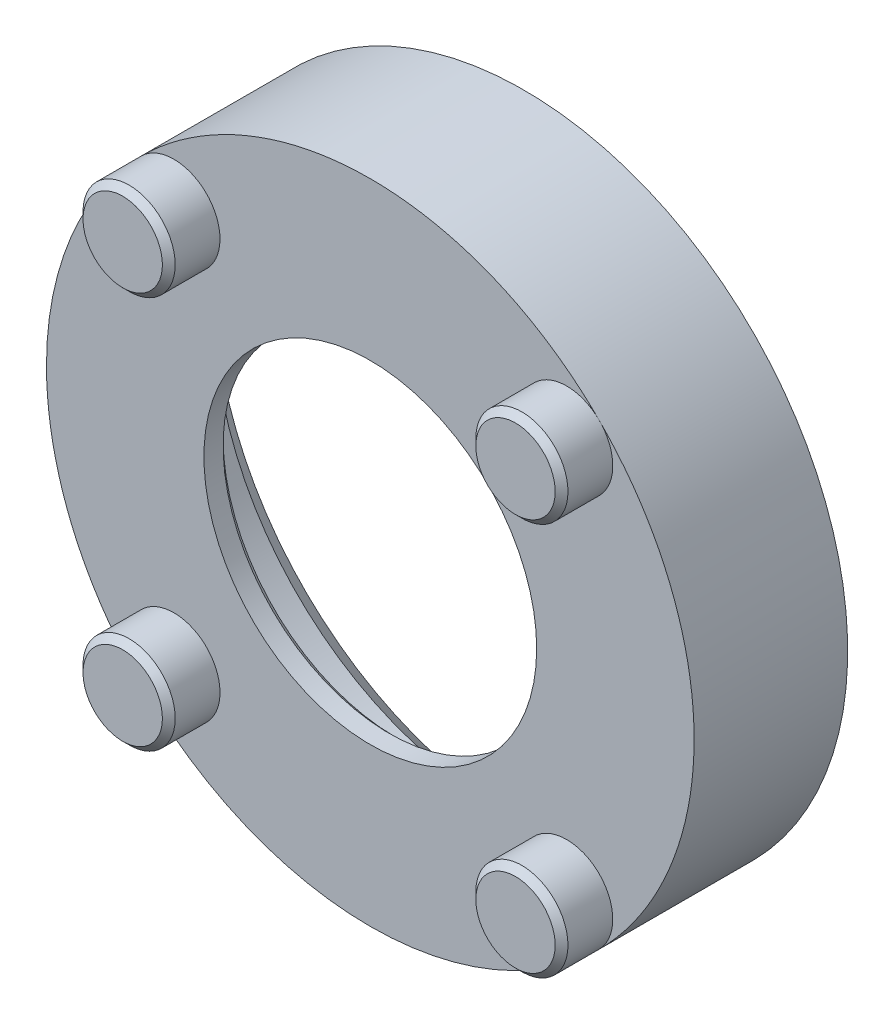
ISO-10303-21;
HEADER;
FILE_DESCRIPTION(('STEP AP214'),'2;1');
FILE_NAME('part.step','',(''),(''),'','','');
FILE_SCHEMA(('AUTOMOTIVE_DESIGN { 1 0 10303 214 1 1 1 1 }'));
ENDSEC;
DATA;
#1=APPLICATION_CONTEXT('core data for automotive mechanical design processes');
#2=APPLICATION_PROTOCOL_DEFINITION('international standard','automotive_design',2000,#1);
#3=PRODUCT_CONTEXT('',#1,'mechanical');
#4=PRODUCT('Part','Part','',(#3));
#5=PRODUCT_RELATED_PRODUCT_CATEGORY('part','',(#4));
#6=PRODUCT_DEFINITION_FORMATION('','',#4);
#7=PRODUCT_DEFINITION_CONTEXT('part definition',#1,'design');
#8=PRODUCT_DEFINITION('design','',#6,#7);
#9=PRODUCT_DEFINITION_SHAPE('','',#8);
#10=(LENGTH_UNIT() NAMED_UNIT(*) SI_UNIT(.MILLI.,.METRE.));
#11=(NAMED_UNIT(*) PLANE_ANGLE_UNIT() SI_UNIT($,.RADIAN.));
#12=(NAMED_UNIT(*) SI_UNIT($,.STERADIAN.) SOLID_ANGLE_UNIT());
#13=UNCERTAINTY_MEASURE_WITH_UNIT(LENGTH_MEASURE(1.E-05),#10,'distance_accuracy_value','');
#14=(GEOMETRIC_REPRESENTATION_CONTEXT(3) GLOBAL_UNCERTAINTY_ASSIGNED_CONTEXT((#13)) GLOBAL_UNIT_ASSIGNED_CONTEXT((#10,
#11,#12)) REPRESENTATION_CONTEXT('',''));
#15=CARTESIAN_POINT('',(0.,0.,0.));
#16=DIRECTION('',(0.,0.,1.));
#17=DIRECTION('',(1.,0.,0.));
#18=AXIS2_PLACEMENT_3D('',#15,#16,#17);
#19=CARTESIAN_POINT('',(7.67210857587403,-7.67210857587405,3.));
#20=DIRECTION('',(0.,0.,-1.));
#21=DIRECTION('',(-1.,0.,0.));
#22=AXIS2_PLACEMENT_3D('',#19,#20,#21);
#23=CYLINDRICAL_SURFACE('',#22,1.8);
#24=CARTESIAN_POINT('',(7.67210857587403,-7.67210857587405,2.75));
#25=DIRECTION('',(0.,0.,1.));
#26=DIRECTION('',(1.,0.,0.));
#27=AXIS2_PLACEMENT_3D('',#24,#25,#26);
#28=CIRCLE('',#27,1.8);
#29=CARTESIAN_POINT('',(9.47210857587403,-7.67210857587405,2.75));
#30=VERTEX_POINT('',#29);
#31=EDGE_CURVE('E140',#30,#30,#28,.F.);
#32=ORIENTED_EDGE('',*,*,#31,.T.);
#33=EDGE_LOOP('',(#32));
#34=FACE_BOUND('',#33,.T.);
#35=CARTESIAN_POINT('',(7.67210857587403,-7.67210857587405,1.));
#36=DIRECTION('',(0.,0.,1.));
#37=DIRECTION('',(1.,0.,0.));
#38=AXIS2_PLACEMENT_3D('',#35,#36,#37);
#39=CIRCLE('',#38,1.8);
#40=CARTESIAN_POINT('',(8.94490078200951,-8.94490078200954,1.));
#41=VERTEX_POINT('',#40);
#42=EDGE_CURVE('E81',#41,#41,#39,.T.);
#43=ORIENTED_EDGE('',*,*,#42,.T.);
#44=EDGE_LOOP('',(#43));
#45=FACE_BOUND('',#44,.T.);
#46=ADVANCED_FACE('F51',(#34,#45),#23,.T.);
#47=CARTESIAN_POINT('',(-7.67210857587375,-7.67210857587433,3.));
#48=DIRECTION('',(0.,0.,-1.));
#49=DIRECTION('',(-1.,0.,0.));
#50=AXIS2_PLACEMENT_3D('',#47,#48,#49);
#51=CYLINDRICAL_SURFACE('',#50,1.8);
#52=CARTESIAN_POINT('',(-7.67210857587375,-7.67210857587433,2.75));
#53=DIRECTION('',(0.,0.,1.));
#54=DIRECTION('',(1.,0.,0.));
#55=AXIS2_PLACEMENT_3D('',#52,#53,#54);
#56=CIRCLE('',#55,1.8);
#57=CARTESIAN_POINT('',(-5.87210857587375,-7.67210857587433,2.75));
#58=VERTEX_POINT('',#57);
#59=EDGE_CURVE('E132',#58,#58,#56,.F.);
#60=ORIENTED_EDGE('',*,*,#59,.T.);
#61=EDGE_LOOP('',(#60));
#62=FACE_BOUND('',#61,.T.);
#63=CARTESIAN_POINT('',(-7.67210857587375,-7.67210857587433,1.));
#64=DIRECTION('',(0.,0.,1.));
#65=DIRECTION('',(1.,0.,0.));
#66=AXIS2_PLACEMENT_3D('',#63,#64,#65);
#67=CIRCLE('',#66,1.8);
#68=CARTESIAN_POINT('',(-8.94490078200919,-8.94490078200987,1.));
#69=VERTEX_POINT('',#68);
#70=EDGE_CURVE('E86',#69,#69,#67,.T.);
#71=ORIENTED_EDGE('',*,*,#70,.T.);
#72=EDGE_LOOP('',(#71));
#73=FACE_BOUND('',#72,.T.);
#74=ADVANCED_FACE('F166',(#62,#73),#51,.T.);
#75=CARTESIAN_POINT('',(-7.67210857587403,7.67210857587344,3.));
#76=DIRECTION('',(0.,0.,-1.));
#77=DIRECTION('',(-1.,0.,0.));
#78=AXIS2_PLACEMENT_3D('',#75,#76,#77);
#79=CYLINDRICAL_SURFACE('',#78,1.8);
#80=CARTESIAN_POINT('',(-7.67210857587403,7.67210857587344,2.75));
#81=DIRECTION('',(0.,0.,1.));
#82=DIRECTION('',(1.,0.,0.));
#83=AXIS2_PLACEMENT_3D('',#80,#81,#82);
#84=CIRCLE('',#83,1.8);
#85=CARTESIAN_POINT('',(-5.87210857587403,7.67210857587344,2.75));
#86=VERTEX_POINT('',#85);
#87=EDGE_CURVE('E116',#86,#86,#84,.F.);
#88=ORIENTED_EDGE('',*,*,#87,.T.);
#89=EDGE_LOOP('',(#88));
#90=FACE_BOUND('',#89,.T.);
#91=CARTESIAN_POINT('',(-7.67210857587403,7.67210857587344,1.));
#92=DIRECTION('',(0.,0.,1.));
#93=DIRECTION('',(1.,0.,0.));
#94=AXIS2_PLACEMENT_3D('',#91,#92,#93);
#95=CIRCLE('',#94,1.8);
#96=CARTESIAN_POINT('',(-8.94490078200987,8.94490078200919,1.));
#97=VERTEX_POINT('',#96);
#98=EDGE_CURVE('E73',#97,#97,#95,.T.);
#99=ORIENTED_EDGE('',*,*,#98,.T.);
#100=EDGE_LOOP('',(#99));
#101=FACE_BOUND('',#100,.T.);
#102=ADVANCED_FACE('F172',(#90,#101),#79,.T.);
#103=CARTESIAN_POINT('',(7.67210857587375,7.67210857587372,3.));
#104=DIRECTION('',(0.,0.,-1.));
#105=DIRECTION('',(-1.,0.,0.));
#106=AXIS2_PLACEMENT_3D('',#103,#104,#105);
#107=CYLINDRICAL_SURFACE('',#106,1.8);
#108=CARTESIAN_POINT('',(7.67210857587375,7.67210857587372,2.75));
#109=DIRECTION('',(0.,0.,1.));
#110=DIRECTION('',(1.,0.,0.));
#111=AXIS2_PLACEMENT_3D('',#108,#109,#110);
#112=CIRCLE('',#111,1.8);
#113=CARTESIAN_POINT('',(9.47210857587375,7.67210857587372,2.75));
#114=VERTEX_POINT('',#113);
#115=EDGE_CURVE('E124',#114,#114,#112,.F.);
#116=ORIENTED_EDGE('',*,*,#115,.T.);
#117=EDGE_LOOP('',(#116));
#118=FACE_BOUND('',#117,.T.);
#119=CARTESIAN_POINT('',(7.67210857587375,7.67210857587372,1.));
#120=DIRECTION('',(0.,0.,1.));
#121=DIRECTION('',(1.,0.,0.));
#122=AXIS2_PLACEMENT_3D('',#119,#120,#121);
#123=CIRCLE('',#122,1.8);
#124=CARTESIAN_POINT('',(8.94490078200955,8.94490078200951,1.));
#125=VERTEX_POINT('',#124);
#126=EDGE_CURVE('E68',#125,#125,#123,.T.);
#127=ORIENTED_EDGE('',*,*,#126,.T.);
#128=EDGE_LOOP('',(#127));
#129=FACE_BOUND('',#128,.T.);
#130=ADVANCED_FACE('F186',(#118,#129),#107,.T.);
#131=CARTESIAN_POINT('',(0.,0.,-5.));
#132=DIRECTION('',(0.,0.,1.));
#133=DIRECTION('',(1.,0.,0.));
#134=AXIS2_PLACEMENT_3D('',#131,#132,#133);
#135=PLANE('',#134);
#136=CARTESIAN_POINT('',(0.,0.,-5.));
#137=DIRECTION('',(0.,0.,1.));
#138=DIRECTION('',(1.,0.,0.));
#139=AXIS2_PLACEMENT_3D('',#136,#137,#138);
#140=CIRCLE('',#139,12.1);
#141=CARTESIAN_POINT('',(12.1,0.,-5.));
#142=VERTEX_POINT('',#141);
#143=EDGE_CURVE('E93',#142,#142,#140,.T.);
#144=ORIENTED_EDGE('',*,*,#143,.T.);
#145=EDGE_LOOP('',(#144));
#146=FACE_BOUND('',#145,.T.);
#147=CARTESIAN_POINT('',(0.,0.,-5.));
#148=DIRECTION('',(0.,0.,-1.));
#149=DIRECTION('',(-1.,0.,0.));
#150=AXIS2_PLACEMENT_3D('',#147,#148,#149);
#151=CIRCLE('',#150,12.6499999999996);
#152=CARTESIAN_POINT('',(-12.6499999999996,0.,-5.));
#153=VERTEX_POINT('',#152);
#154=EDGE_CURVE('E112',#153,#153,#151,.T.);
#155=ORIENTED_EDGE('',*,*,#154,.T.);
#156=EDGE_LOOP('',(#155));
#157=FACE_BOUND('',#156,.T.);
#158=ADVANCED_FACE('F182',(#146,#157),#135,.F.);
#159=CARTESIAN_POINT('',(0.,0.,-5.));
#160=DIRECTION('',(0.,0.,1.));
#161=DIRECTION('',(1.,0.,0.));
#162=AXIS2_PLACEMENT_3D('',#159,#160,#161);
#163=CYLINDRICAL_SURFACE('',#162,11.1);
#164=CARTESIAN_POINT('',(0.,0.,-3.99999999999999));
#165=DIRECTION('',(0.,0.,1.));
#166=DIRECTION('',(1.,0.,0.));
#167=AXIS2_PLACEMENT_3D('',#164,#165,#166);
#168=CIRCLE('',#167,11.1);
#169=CARTESIAN_POINT('',(11.1,0.,-3.99999999999999));
#170=VERTEX_POINT('',#169);
#171=EDGE_CURVE('E102',#170,#170,#168,.F.);
#172=ORIENTED_EDGE('',*,*,#171,.T.);
#173=EDGE_LOOP('',(#172));
#174=FACE_BOUND('',#173,.T.);
#175=CARTESIAN_POINT('',(0.,0.,0.));
#176=DIRECTION('',(0.,0.,1.));
#177=DIRECTION('',(1.,0.,0.));
#178=AXIS2_PLACEMENT_3D('',#175,#176,#177);
#179=CIRCLE('',#178,11.1);
#180=CARTESIAN_POINT('',(11.1,0.,0.));
#181=VERTEX_POINT('',#180);
#182=EDGE_CURVE('E85',#181,#181,#179,.T.);
#183=ORIENTED_EDGE('',*,*,#182,.T.);
#184=EDGE_LOOP('',(#183));
#185=FACE_BOUND('',#184,.T.);
#186=ADVANCED_FACE('F178',(#174,#185),#163,.F.);
#187=CARTESIAN_POINT('',(0.,0.,-5.));
#188=DIRECTION('',(0.,0.,-1.));
#189=DIRECTION('',(-1.,0.,0.));
#190=AXIS2_PLACEMENT_3D('',#187,#188,#189);
#191=CONICAL_SURFACE('',#190,12.1,0.785398163397447);
#192=ORIENTED_EDGE('',*,*,#171,.F.);
#193=EDGE_LOOP('',(#192));
#194=FACE_BOUND('',#193,.T.);
#195=ORIENTED_EDGE('',*,*,#143,.F.);
#196=EDGE_LOOP('',(#195));
#197=FACE_BOUND('',#196,.T.);
#198=ADVANCED_FACE('F181',(#194,#197),#191,.F.);
#199=CARTESIAN_POINT('',(7.67210857587403,-7.67210857587405,3.));
#200=DIRECTION('',(0.,0.,1.));
#201=DIRECTION('',(1.,0.,0.));
#202=AXIS2_PLACEMENT_3D('',#199,#200,#201);
#203=PLANE('',#202);
#204=CARTESIAN_POINT('',(7.67210857587403,-7.67210857587405,3.));
#205=DIRECTION('',(0.,0.,1.));
#206=DIRECTION('',(1.,0.,0.));
#207=AXIS2_PLACEMENT_3D('',#204,#205,#206);
#208=CIRCLE('',#207,1.55);
#209=CARTESIAN_POINT('',(9.22210857587403,-7.67210857587405,3.));
#210=VERTEX_POINT('',#209);
#211=EDGE_CURVE('E136',#210,#210,#208,.T.);
#212=ORIENTED_EDGE('',*,*,#211,.T.);
#213=EDGE_LOOP('',(#212));
#214=FACE_BOUND('',#213,.T.);
#215=ADVANCED_FACE('F194',(#214),#203,.T.);
#216=CARTESIAN_POINT('',(7.67210857587403,-7.67210857587405,0.));
#217=DIRECTION('',(0.,0.,1.));
#218=DIRECTION('',(1.,0.,0.));
#219=AXIS2_PLACEMENT_3D('',#216,#217,#218);
#220=PLANE('',#219);
#221=CARTESIAN_POINT('',(0.,0.,0.));
#222=DIRECTION('',(0.,0.,1.));
#223=DIRECTION('',(1.,0.,0.));
#224=AXIS2_PLACEMENT_3D('',#221,#222,#223);
#225=CIRCLE('',#224,6.75);
#226=CARTESIAN_POINT('',(6.75,0.,0.));
#227=VERTEX_POINT('',#226);
#228=EDGE_CURVE('E61',#227,#227,#225,.T.);
#229=ORIENTED_EDGE('',*,*,#228,.T.);
#230=EDGE_LOOP('',(#229));
#231=FACE_BOUND('',#230,.T.);
#232=ORIENTED_EDGE('',*,*,#182,.F.);
#233=EDGE_LOOP('',(#232));
#234=FACE_BOUND('',#233,.T.);
#235=ADVANCED_FACE('F149',(#231,#234),#220,.F.);
#236=CARTESIAN_POINT('',(-7.67210857587375,-7.67210857587433,3.));
#237=DIRECTION('',(0.,0.,1.));
#238=DIRECTION('',(1.,0.,0.));
#239=AXIS2_PLACEMENT_3D('',#236,#237,#238);
#240=PLANE('',#239);
#241=CARTESIAN_POINT('',(-7.67210857587375,-7.67210857587433,3.));
#242=DIRECTION('',(0.,0.,1.));
#243=DIRECTION('',(1.,0.,0.));
#244=AXIS2_PLACEMENT_3D('',#241,#242,#243);
#245=CIRCLE('',#244,1.55);
#246=CARTESIAN_POINT('',(-6.12210857587374,-7.67210857587433,3.));
#247=VERTEX_POINT('',#246);
#248=EDGE_CURVE('E128',#247,#247,#245,.T.);
#249=ORIENTED_EDGE('',*,*,#248,.T.);
#250=EDGE_LOOP('',(#249));
#251=FACE_BOUND('',#250,.T.);
#252=ADVANCED_FACE('F226',(#251),#240,.T.);
#253=CARTESIAN_POINT('',(-7.67210857587403,7.67210857587344,3.));
#254=DIRECTION('',(0.,0.,1.));
#255=DIRECTION('',(1.,0.,0.));
#256=AXIS2_PLACEMENT_3D('',#253,#254,#255);
#257=PLANE('',#256);
#258=CARTESIAN_POINT('',(-7.67210857587403,7.67210857587344,3.));
#259=DIRECTION('',(0.,0.,1.));
#260=DIRECTION('',(1.,0.,0.));
#261=AXIS2_PLACEMENT_3D('',#258,#259,#260);
#262=CIRCLE('',#261,1.55);
#263=CARTESIAN_POINT('',(-6.12210857587402,7.67210857587344,3.));
#264=VERTEX_POINT('',#263);
#265=EDGE_CURVE('E108',#264,#264,#262,.T.);
#266=ORIENTED_EDGE('',*,*,#265,.T.);
#267=EDGE_LOOP('',(#266));
#268=FACE_BOUND('',#267,.T.);
#269=ADVANCED_FACE('F228',(#268),#257,.T.);
#270=CARTESIAN_POINT('',(7.67210857587375,7.67210857587372,3.));
#271=DIRECTION('',(0.,0.,1.));
#272=DIRECTION('',(1.,0.,0.));
#273=AXIS2_PLACEMENT_3D('',#270,#271,#272);
#274=PLANE('',#273);
#275=CARTESIAN_POINT('',(7.67210857587375,7.67210857587372,3.));
#276=DIRECTION('',(0.,0.,1.));
#277=DIRECTION('',(1.,0.,0.));
#278=AXIS2_PLACEMENT_3D('',#275,#276,#277);
#279=CIRCLE('',#278,1.55);
#280=CARTESIAN_POINT('',(9.22210857587375,7.67210857587372,3.));
#281=VERTEX_POINT('',#280);
#282=EDGE_CURVE('E120',#281,#281,#279,.T.);
#283=ORIENTED_EDGE('',*,*,#282,.T.);
#284=EDGE_LOOP('',(#283));
#285=FACE_BOUND('',#284,.T.);
#286=ADVANCED_FACE('F234',(#285),#274,.T.);
#287=CARTESIAN_POINT('',(0.,0.,1.));
#288=DIRECTION('',(0.,0.,1.));
#289=DIRECTION('',(1.,0.,0.));
#290=AXIS2_PLACEMENT_3D('',#287,#288,#289);
#291=PLANE('',#290);
#292=CARTESIAN_POINT('',(0.,0.,1.));
#293=DIRECTION('',(0.,0.,1.));
#294=DIRECTION('',(1.,0.,0.));
#295=AXIS2_PLACEMENT_3D('',#292,#293,#294);
#296=CIRCLE('',#295,6.5);
#297=CARTESIAN_POINT('',(6.5,0.,1.));
#298=VERTEX_POINT('',#297);
#299=EDGE_CURVE('E109',#298,#298,#296,.F.);
#300=ORIENTED_EDGE('',*,*,#299,.T.);
#301=EDGE_LOOP('',(#300));
#302=FACE_BOUND('',#301,.T.);
#303=ORIENTED_EDGE('',*,*,#42,.F.);
#304=CARTESIAN_POINT('',(0.,0.,1.));
#305=DIRECTION('',(0.,0.,1.));
#306=DIRECTION('',(1.,0.,0.));
#307=AXIS2_PLACEMENT_3D('',#304,#305,#306);
#308=CIRCLE('',#307,12.6499999999996);
#309=EDGE_CURVE('E455',#125,#41,#308,.F.);
#310=ORIENTED_EDGE('',*,*,#309,.F.);
#311=ORIENTED_EDGE('',*,*,#126,.F.);
#312=EDGE_CURVE('E460',#97,#125,#308,.F.);
#313=ORIENTED_EDGE('',*,*,#312,.F.);
#314=ORIENTED_EDGE('',*,*,#98,.F.);
#315=EDGE_CURVE('E465',#69,#97,#308,.F.);
#316=ORIENTED_EDGE('',*,*,#315,.F.);
#317=ORIENTED_EDGE('',*,*,#70,.F.);
#318=EDGE_CURVE('E462',#41,#69,#308,.F.);
#319=ORIENTED_EDGE('',*,*,#318,.F.);
#320=EDGE_LOOP('',(#303,#310,#311,#313,#314,#316,#317,#319));
#321=FACE_BOUND('',#320,.T.);
#322=ADVANCED_FACE('F265',(#302,#321),#291,.T.);
#323=CARTESIAN_POINT('',(0.,0.,3.));
#324=DIRECTION('',(0.,0.,-1.));
#325=DIRECTION('',(-1.,0.,0.));
#326=AXIS2_PLACEMENT_3D('',#323,#324,#325);
#327=CYLINDRICAL_SURFACE('',#326,6.5);
#328=CARTESIAN_POINT('',(0.,0.,0.249999999999997));
#329=DIRECTION('',(0.,0.,1.));
#330=DIRECTION('',(1.,0.,0.));
#331=AXIS2_PLACEMENT_3D('',#328,#329,#330);
#332=CIRCLE('',#331,6.5);
#333=CARTESIAN_POINT('',(6.5,0.,0.249999999999997));
#334=VERTEX_POINT('',#333);
#335=EDGE_CURVE('E11',#334,#334,#332,.F.);
#336=ORIENTED_EDGE('',*,*,#335,.T.);
#337=EDGE_LOOP('',(#336));
#338=FACE_BOUND('',#337,.T.);
#339=ORIENTED_EDGE('',*,*,#299,.F.);
#340=EDGE_LOOP('',(#339));
#341=FACE_BOUND('',#340,.T.);
#342=ADVANCED_FACE('F203',(#338,#341),#327,.F.);
#343=CARTESIAN_POINT('',(-7.67210857587403,7.67210857587344,3.));
#344=DIRECTION('',(0.,0.,-1.));
#345=DIRECTION('',(-1.,0.,0.));
#346=AXIS2_PLACEMENT_3D('',#343,#344,#345);
#347=CONICAL_SURFACE('',#346,1.55,0.785398163397437);
#348=ORIENTED_EDGE('',*,*,#87,.F.);
#349=EDGE_LOOP('',(#348));
#350=FACE_BOUND('',#349,.T.);
#351=ORIENTED_EDGE('',*,*,#265,.F.);
#352=EDGE_LOOP('',(#351));
#353=FACE_BOUND('',#352,.T.);
#354=ADVANCED_FACE('F196',(#350,#353),#347,.T.);
#355=CARTESIAN_POINT('',(7.67210857587375,7.67210857587372,3.));
#356=DIRECTION('',(0.,0.,-1.));
#357=DIRECTION('',(-1.,0.,0.));
#358=AXIS2_PLACEMENT_3D('',#355,#356,#357);
#359=CONICAL_SURFACE('',#358,1.55,0.785398163397442);
#360=ORIENTED_EDGE('',*,*,#115,.F.);
#361=EDGE_LOOP('',(#360));
#362=FACE_BOUND('',#361,.T.);
#363=ORIENTED_EDGE('',*,*,#282,.F.);
#364=EDGE_LOOP('',(#363));
#365=FACE_BOUND('',#364,.T.);
#366=ADVANCED_FACE('F202',(#362,#365),#359,.T.);
#367=CARTESIAN_POINT('',(-7.67210857587375,-7.67210857587433,3.));
#368=DIRECTION('',(0.,0.,-1.));
#369=DIRECTION('',(-1.,0.,0.));
#370=AXIS2_PLACEMENT_3D('',#367,#368,#369);
#371=CONICAL_SURFACE('',#370,1.55,0.785398163397439);
#372=ORIENTED_EDGE('',*,*,#59,.F.);
#373=EDGE_LOOP('',(#372));
#374=FACE_BOUND('',#373,.T.);
#375=ORIENTED_EDGE('',*,*,#248,.F.);
#376=EDGE_LOOP('',(#375));
#377=FACE_BOUND('',#376,.T.);
#378=ADVANCED_FACE('F162',(#374,#377),#371,.T.);
#379=CARTESIAN_POINT('',(7.67210857587403,-7.67210857587405,3.));
#380=DIRECTION('',(0.,0.,-1.));
#381=DIRECTION('',(-1.,0.,0.));
#382=AXIS2_PLACEMENT_3D('',#379,#380,#381);
#383=CONICAL_SURFACE('',#382,1.55,0.785398163397442);
#384=ORIENTED_EDGE('',*,*,#31,.F.);
#385=EDGE_LOOP('',(#384));
#386=FACE_BOUND('',#385,.T.);
#387=ORIENTED_EDGE('',*,*,#211,.F.);
#388=EDGE_LOOP('',(#387));
#389=FACE_BOUND('',#388,.T.);
#390=ADVANCED_FACE('F154',(#386,#389),#383,.T.);
#391=CARTESIAN_POINT('',(0.,0.,0.));
#392=DIRECTION('',(0.,0.,-1.));
#393=DIRECTION('',(-1.,0.,0.));
#394=AXIS2_PLACEMENT_3D('',#391,#392,#393);
#395=CONICAL_SURFACE('',#394,6.75,0.785398163397452);
#396=ORIENTED_EDGE('',*,*,#335,.F.);
#397=EDGE_LOOP('',(#396));
#398=FACE_BOUND('',#397,.T.);
#399=ORIENTED_EDGE('',*,*,#228,.F.);
#400=EDGE_LOOP('',(#399));
#401=FACE_BOUND('',#400,.T.);
#402=ADVANCED_FACE('F54',(#398,#401),#395,.F.);
#403=CARTESIAN_POINT('',(0.,0.,36.7796031280381));
#404=DIRECTION('',(0.,0.,-1.));
#405=DIRECTION('',(-1.,0.,0.));
#406=AXIS2_PLACEMENT_3D('',#403,#404,#405);
#407=CYLINDRICAL_SURFACE('',#406,12.6499999999996);
#408=ORIENTED_EDGE('',*,*,#154,.F.);
#409=EDGE_LOOP('',(#408));
#410=FACE_BOUND('',#409,.T.);
#411=ORIENTED_EDGE('',*,*,#318,.T.);
#412=ORIENTED_EDGE('',*,*,#315,.T.);
#413=ORIENTED_EDGE('',*,*,#312,.T.);
#414=ORIENTED_EDGE('',*,*,#309,.T.);
#415=EDGE_LOOP('',(#411,#412,#413,#414));
#416=FACE_BOUND('',#415,.T.);
#417=ADVANCED_FACE('F153',(#410,#416),#407,.T.);
#418=CLOSED_SHELL('',(#46,#74,#102,#130,#158,#186,#198,#215,#235,#252,#269,#286,#322,#342,#354,
#366,#378,#390,#402,#417));
#419=MANIFOLD_SOLID_BREP('B2',#418);
#420=ADVANCED_BREP_SHAPE_REPRESENTATION('',(#18,#419),#14);
#421=SHAPE_DEFINITION_REPRESENTATION(#9,#420);
ENDSEC;
END-ISO-10303-21;
